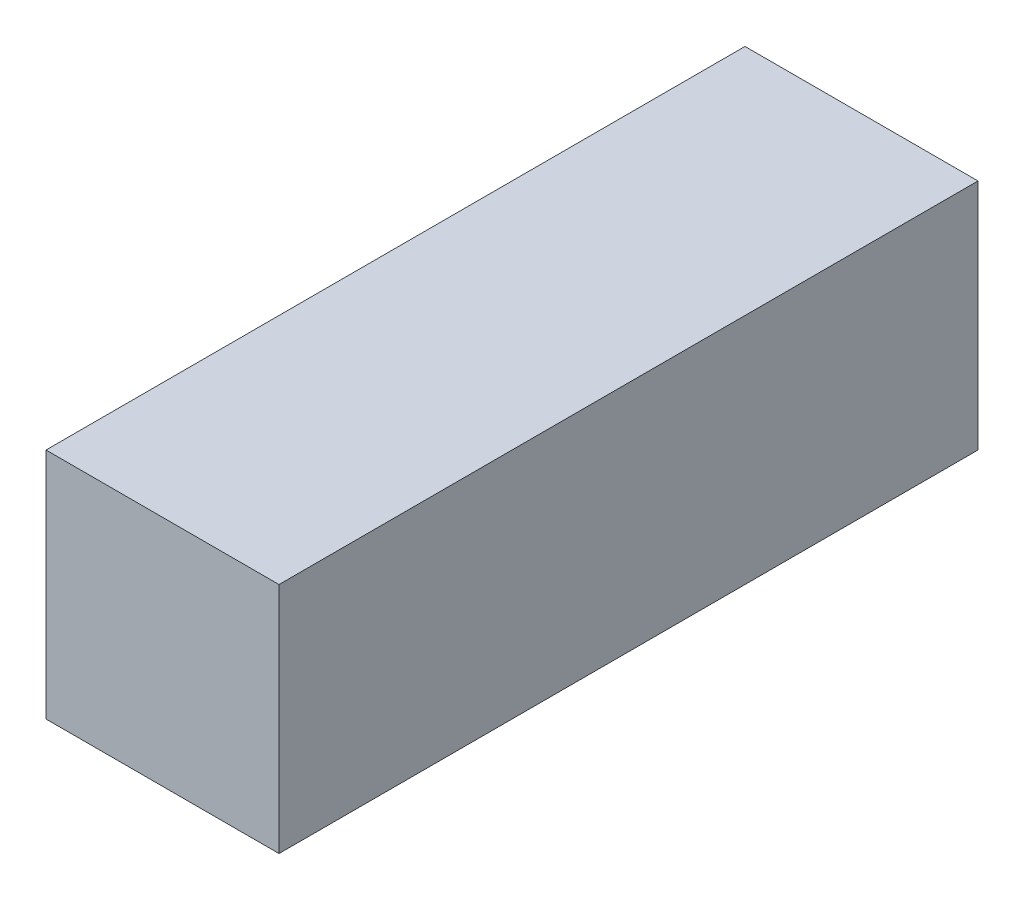
ISO-10303-21;
HEADER;
FILE_DESCRIPTION(('STEP AP214'),'2;1');
FILE_NAME('part.step','',(''),(''),'','','');
FILE_SCHEMA(('AUTOMOTIVE_DESIGN { 1 0 10303 214 1 1 1 1 }'));
ENDSEC;
DATA;
#1=APPLICATION_CONTEXT('core data for automotive mechanical design processes');
#2=APPLICATION_PROTOCOL_DEFINITION('international standard','automotive_design',2000,#1);
#3=PRODUCT_CONTEXT('',#1,'mechanical');
#4=PRODUCT('Part','Part','',(#3));
#5=PRODUCT_RELATED_PRODUCT_CATEGORY('part','',(#4));
#6=PRODUCT_DEFINITION_FORMATION('','',#4);
#7=PRODUCT_DEFINITION_CONTEXT('part definition',#1,'design');
#8=PRODUCT_DEFINITION('design','',#6,#7);
#9=PRODUCT_DEFINITION_SHAPE('','',#8);
#10=(LENGTH_UNIT() NAMED_UNIT(*) SI_UNIT(.MILLI.,.METRE.));
#11=(NAMED_UNIT(*) PLANE_ANGLE_UNIT() SI_UNIT($,.RADIAN.));
#12=(NAMED_UNIT(*) SI_UNIT($,.STERADIAN.) SOLID_ANGLE_UNIT());
#13=UNCERTAINTY_MEASURE_WITH_UNIT(LENGTH_MEASURE(1.E-05),#10,'distance_accuracy_value','');
#14=(GEOMETRIC_REPRESENTATION_CONTEXT(3) GLOBAL_UNCERTAINTY_ASSIGNED_CONTEXT((#13)) GLOBAL_UNIT_ASSIGNED_CONTEXT((#10,
#11,#12)) REPRESENTATION_CONTEXT('',''));
#15=CARTESIAN_POINT('',(0.,0.,0.));
#16=DIRECTION('',(0.,0.,1.));
#17=DIRECTION('',(1.,0.,0.));
#18=AXIS2_PLACEMENT_3D('',#15,#16,#17);
#19=CARTESIAN_POINT('',(-2.38125,-2.38125,7.14375));
#20=DIRECTION('',(1.,0.,0.));
#21=DIRECTION('',(0.,0.,-1.));
#22=AXIS2_PLACEMENT_3D('',#19,#20,#21);
#23=PLANE('',#22);
#24=DIRECTION('',(0.,-1.,0.));
#25=VECTOR('',#24,1.);
#26=CARTESIAN_POINT('',(-2.38125,-2.38125,-7.14375));
#27=LINE('',#26,#25);
#28=CARTESIAN_POINT('',(-2.38125,2.38125,-7.14375));
#29=VERTEX_POINT('',#28);
#30=CARTESIAN_POINT('',(-2.38125,-2.38125,-7.14375));
#31=VERTEX_POINT('',#30);
#32=EDGE_CURVE('E97',#29,#31,#27,.T.);
#33=ORIENTED_EDGE('',*,*,#32,.T.);
#34=DIRECTION('',(0.,0.,-1.));
#35=VECTOR('',#34,1.);
#36=CARTESIAN_POINT('',(-2.38125,-2.38125,7.14375));
#37=LINE('',#36,#35);
#38=CARTESIAN_POINT('',(-2.38125,-2.38125,7.14375));
#39=VERTEX_POINT('',#38);
#40=EDGE_CURVE('E11',#39,#31,#37,.T.);
#41=ORIENTED_EDGE('',*,*,#40,.F.);
#42=DIRECTION('',(0.,-1.,0.));
#43=VECTOR('',#42,1.);
#44=CARTESIAN_POINT('',(-2.38125,-2.38125,7.14375));
#45=LINE('',#44,#43);
#46=CARTESIAN_POINT('',(-2.38125,2.38125,7.14375));
#47=VERTEX_POINT('',#46);
#48=EDGE_CURVE('E85',#47,#39,#45,.T.);
#49=ORIENTED_EDGE('',*,*,#48,.F.);
#50=DIRECTION('',(0.,0.,-1.));
#51=VECTOR('',#50,1.);
#52=CARTESIAN_POINT('',(-2.38125,2.38125,7.14375));
#53=LINE('',#52,#51);
#54=EDGE_CURVE('E93',#47,#29,#53,.T.);
#55=ORIENTED_EDGE('',*,*,#54,.T.);
#56=EDGE_LOOP('',(#33,#41,#49,#55));
#57=FACE_BOUND('',#56,.T.);
#58=ADVANCED_FACE('F34',(#57),#23,.F.);
#59=CARTESIAN_POINT('',(2.38125,-2.38125,7.14375));
#60=DIRECTION('',(0.,1.,0.));
#61=DIRECTION('',(-1.,0.,0.));
#62=AXIS2_PLACEMENT_3D('',#59,#60,#61);
#63=PLANE('',#62);
#64=DIRECTION('',(1.,0.,0.));
#65=VECTOR('',#64,1.);
#66=CARTESIAN_POINT('',(2.38125,-2.38125,-7.14375));
#67=LINE('',#66,#65);
#68=CARTESIAN_POINT('',(2.38125,-2.38125,-7.14375));
#69=VERTEX_POINT('',#68);
#70=EDGE_CURVE('E89',#31,#69,#67,.T.);
#71=ORIENTED_EDGE('',*,*,#70,.T.);
#72=DIRECTION('',(0.,0.,-1.));
#73=VECTOR('',#72,1.);
#74=CARTESIAN_POINT('',(2.38125,-2.38125,7.14375));
#75=LINE('',#74,#73);
#76=CARTESIAN_POINT('',(2.38125,-2.38125,7.14375));
#77=VERTEX_POINT('',#76);
#78=EDGE_CURVE('E42',#77,#69,#75,.T.);
#79=ORIENTED_EDGE('',*,*,#78,.F.);
#80=DIRECTION('',(1.,0.,0.));
#81=VECTOR('',#80,1.);
#82=CARTESIAN_POINT('',(2.38125,-2.38125,7.14375));
#83=LINE('',#82,#81);
#84=EDGE_CURVE('E80',#39,#77,#83,.T.);
#85=ORIENTED_EDGE('',*,*,#84,.F.);
#86=ORIENTED_EDGE('',*,*,#40,.T.);
#87=EDGE_LOOP('',(#71,#79,#85,#86));
#88=FACE_BOUND('',#87,.T.);
#89=ADVANCED_FACE('F88',(#88),#63,.F.);
#90=CARTESIAN_POINT('',(2.38125,-2.38125,7.14375));
#91=DIRECTION('',(-1.,0.,0.));
#92=DIRECTION('',(0.,0.,1.));
#93=AXIS2_PLACEMENT_3D('',#90,#91,#92);
#94=PLANE('',#93);
#95=DIRECTION('',(0.,1.,0.));
#96=VECTOR('',#95,1.);
#97=CARTESIAN_POINT('',(2.38125,-2.38125,-7.14375));
#98=LINE('',#97,#96);
#99=CARTESIAN_POINT('',(2.38125,2.38125,-7.14375));
#100=VERTEX_POINT('',#99);
#101=EDGE_CURVE('E67',#69,#100,#98,.T.);
#102=ORIENTED_EDGE('',*,*,#101,.T.);
#103=DIRECTION('',(0.,0.,-1.));
#104=VECTOR('',#103,1.);
#105=CARTESIAN_POINT('',(2.38125,2.38125,7.14375));
#106=LINE('',#105,#104);
#107=CARTESIAN_POINT('',(2.38125,2.38125,7.14375));
#108=VERTEX_POINT('',#107);
#109=EDGE_CURVE('E90',#108,#100,#106,.T.);
#110=ORIENTED_EDGE('',*,*,#109,.F.);
#111=DIRECTION('',(0.,1.,0.));
#112=VECTOR('',#111,1.);
#113=CARTESIAN_POINT('',(2.38125,-2.38125,7.14375));
#114=LINE('',#113,#112);
#115=EDGE_CURVE('E83',#77,#108,#114,.T.);
#116=ORIENTED_EDGE('',*,*,#115,.F.);
#117=ORIENTED_EDGE('',*,*,#78,.T.);
#118=EDGE_LOOP('',(#102,#110,#116,#117));
#119=FACE_BOUND('',#118,.T.);
#120=ADVANCED_FACE('F91',(#119),#94,.F.);
#121=CARTESIAN_POINT('',(2.38125,2.38125,7.14375));
#122=DIRECTION('',(0.,-1.,0.));
#123=DIRECTION('',(1.,0.,0.));
#124=AXIS2_PLACEMENT_3D('',#121,#122,#123);
#125=PLANE('',#124);
#126=DIRECTION('',(-1.,0.,0.));
#127=VECTOR('',#126,1.);
#128=CARTESIAN_POINT('',(2.38125,2.38125,-7.14375));
#129=LINE('',#128,#127);
#130=EDGE_CURVE('E73',#100,#29,#129,.T.);
#131=ORIENTED_EDGE('',*,*,#130,.T.);
#132=ORIENTED_EDGE('',*,*,#54,.F.);
#133=DIRECTION('',(-1.,0.,0.));
#134=VECTOR('',#133,1.);
#135=CARTESIAN_POINT('',(2.38125,2.38125,7.14375));
#136=LINE('',#135,#134);
#137=EDGE_CURVE('E50',#108,#47,#136,.T.);
#138=ORIENTED_EDGE('',*,*,#137,.F.);
#139=ORIENTED_EDGE('',*,*,#109,.T.);
#140=EDGE_LOOP('',(#131,#132,#138,#139));
#141=FACE_BOUND('',#140,.T.);
#142=ADVANCED_FACE('F104',(#141),#125,.F.);
#143=CARTESIAN_POINT('',(0.,0.,7.14375));
#144=DIRECTION('',(0.,0.,1.));
#145=DIRECTION('',(1.,0.,0.));
#146=AXIS2_PLACEMENT_3D('',#143,#144,#145);
#147=PLANE('',#146);
#148=ORIENTED_EDGE('',*,*,#48,.T.);
#149=ORIENTED_EDGE('',*,*,#84,.T.);
#150=ORIENTED_EDGE('',*,*,#115,.T.);
#151=ORIENTED_EDGE('',*,*,#137,.T.);
#152=EDGE_LOOP('',(#148,#149,#150,#151));
#153=FACE_BOUND('',#152,.T.);
#154=ADVANCED_FACE('F81',(#153),#147,.T.);
#155=CARTESIAN_POINT('',(0.,0.,-7.14375));
#156=DIRECTION('',(0.,0.,1.));
#157=DIRECTION('',(1.,0.,0.));
#158=AXIS2_PLACEMENT_3D('',#155,#156,#157);
#159=PLANE('',#158);
#160=ORIENTED_EDGE('',*,*,#32,.F.);
#161=ORIENTED_EDGE('',*,*,#130,.F.);
#162=ORIENTED_EDGE('',*,*,#101,.F.);
#163=ORIENTED_EDGE('',*,*,#70,.F.);
#164=EDGE_LOOP('',(#160,#161,#162,#163));
#165=FACE_BOUND('',#164,.T.);
#166=ADVANCED_FACE('F107',(#165),#159,.F.);
#167=CLOSED_SHELL('',(#58,#89,#120,#142,#154,#166));
#168=MANIFOLD_SOLID_BREP('B2',#167);
#169=ADVANCED_BREP_SHAPE_REPRESENTATION('',(#18,#168),#14);
#170=SHAPE_DEFINITION_REPRESENTATION(#9,#169);
ENDSEC;
END-ISO-10303-21;
